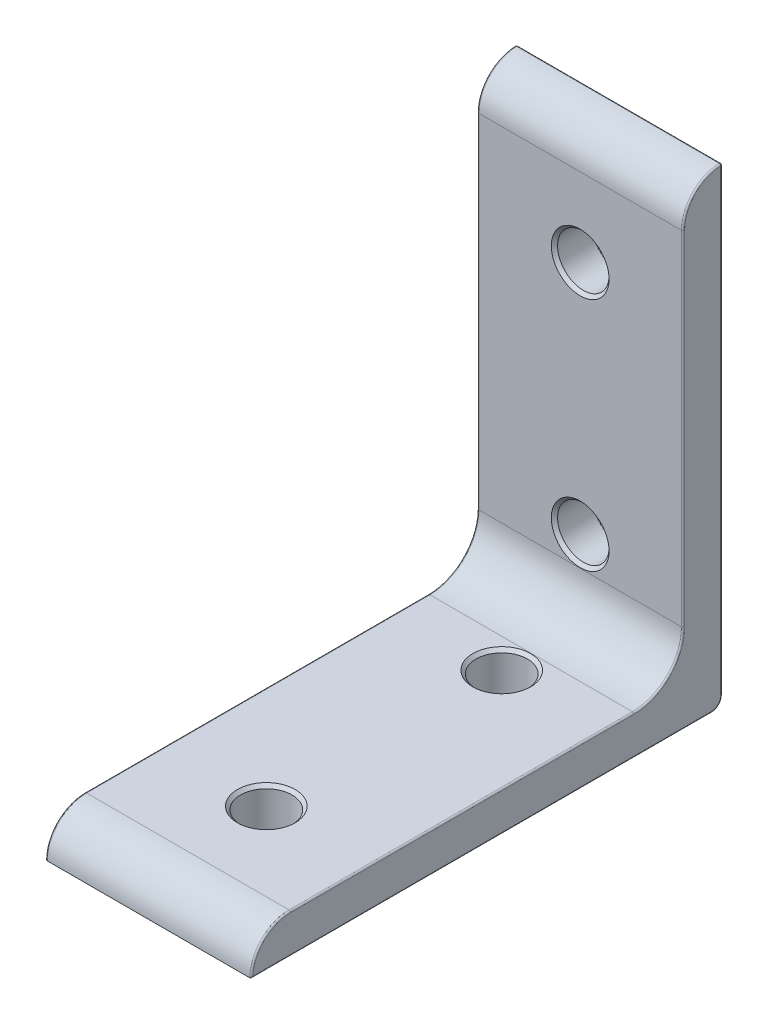
ISO-10303-21;
HEADER;
FILE_DESCRIPTION(('STEP AP214'),'2;1');
FILE_NAME('part.step','',(''),(''),'','','');
FILE_SCHEMA(('AUTOMOTIVE_DESIGN { 1 0 10303 214 1 1 1 1 }'));
ENDSEC;
DATA;
#1=APPLICATION_CONTEXT('core data for automotive mechanical design processes');
#2=APPLICATION_PROTOCOL_DEFINITION('international standard','automotive_design',2000,#1);
#3=PRODUCT_CONTEXT('',#1,'mechanical');
#4=PRODUCT('Part','Part','',(#3));
#5=PRODUCT_RELATED_PRODUCT_CATEGORY('part','',(#4));
#6=PRODUCT_DEFINITION_FORMATION('','',#4);
#7=PRODUCT_DEFINITION_CONTEXT('part definition',#1,'design');
#8=PRODUCT_DEFINITION('design','',#6,#7);
#9=PRODUCT_DEFINITION_SHAPE('','',#8);
#10=(LENGTH_UNIT() NAMED_UNIT(*) SI_UNIT(.MILLI.,.METRE.));
#11=(NAMED_UNIT(*) PLANE_ANGLE_UNIT() SI_UNIT($,.RADIAN.));
#12=(NAMED_UNIT(*) SI_UNIT($,.STERADIAN.) SOLID_ANGLE_UNIT());
#13=UNCERTAINTY_MEASURE_WITH_UNIT(LENGTH_MEASURE(1.E-05),#10,'distance_accuracy_value','');
#14=(GEOMETRIC_REPRESENTATION_CONTEXT(3) GLOBAL_UNCERTAINTY_ASSIGNED_CONTEXT((#13)) GLOBAL_UNIT_ASSIGNED_CONTEXT((#10,
#11,#12)) REPRESENTATION_CONTEXT('',''));
#15=CARTESIAN_POINT('',(0.,0.,0.));
#16=DIRECTION('',(0.,0.,1.));
#17=DIRECTION('',(1.,0.,0.));
#18=AXIS2_PLACEMENT_3D('',#15,#16,#17);
#19=CARTESIAN_POINT('',(-16.637,-38.1,63.5));
#20=DIRECTION('',(1.,0.,0.));
#21=DIRECTION('',(0.,0.,-1.));
#22=AXIS2_PLACEMENT_3D('',#19,#20,#21);
#23=CYLINDRICAL_SURFACE('',#22,6.35);
#24=DIRECTION('',(1.,0.,0.));
#25=VECTOR('',#24,1.);
#26=CARTESIAN_POINT('',(-16.637,-31.75,63.5));
#27=LINE('',#26,#25);
#28=CARTESIAN_POINT('',(-16.383,-31.75,63.5));
#29=VERTEX_POINT('',#28);
#30=CARTESIAN_POINT('',(16.383,-31.75,63.5));
#31=VERTEX_POINT('',#30);
#32=EDGE_CURVE('E213',#29,#31,#27,.T.);
#33=ORIENTED_EDGE('',*,*,#32,.F.);
#34=CARTESIAN_POINT('',(-16.383,-38.1,63.5));
#35=DIRECTION('',(1.,0.,0.));
#36=DIRECTION('',(0.,0.,-1.));
#37=AXIS2_PLACEMENT_3D('',#34,#35,#36);
#38=CIRCLE('',#37,6.35);
#39=CARTESIAN_POINT('',(-16.383,-38.1,69.85));
#40=VERTEX_POINT('',#39);
#41=EDGE_CURVE('E327',#29,#40,#38,.T.);
#42=ORIENTED_EDGE('',*,*,#41,.T.);
#43=DIRECTION('',(1.,0.,0.));
#44=VECTOR('',#43,1.);
#45=CARTESIAN_POINT('',(-16.637,-38.1,69.85));
#46=LINE('',#45,#44);
#47=CARTESIAN_POINT('',(16.383,-38.1,69.85));
#48=VERTEX_POINT('',#47);
#49=EDGE_CURVE('E203',#40,#48,#46,.T.);
#50=ORIENTED_EDGE('',*,*,#49,.T.);
#51=CARTESIAN_POINT('',(16.383,-38.1,63.5));
#52=DIRECTION('',(1.,0.,0.));
#53=DIRECTION('',(0.,0.,-1.));
#54=AXIS2_PLACEMENT_3D('',#51,#52,#53);
#55=CIRCLE('',#54,6.35);
#56=EDGE_CURVE('E324',#48,#31,#55,.F.);
#57=ORIENTED_EDGE('',*,*,#56,.T.);
#58=EDGE_LOOP('',(#33,#42,#50,#57));
#59=FACE_BOUND('',#58,.T.);
#60=ADVANCED_FACE('F51',(#59),#23,.T.);
#61=CARTESIAN_POINT('',(-16.637,-31.75,7.93749999999999));
#62=DIRECTION('',(0.,1.,0.));
#63=DIRECTION('',(0.,0.,1.));
#64=AXIS2_PLACEMENT_3D('',#61,#62,#63);
#65=PLANE('',#64);
#66=CARTESIAN_POINT('',(0.,-31.75,50.8));
#67=DIRECTION('',(0.,1.,0.));
#68=DIRECTION('',(0.,0.,1.));
#69=AXIS2_PLACEMENT_3D('',#66,#67,#68);
#70=CIRCLE('',#69,4.67360000000003);
#71=CARTESIAN_POINT('',(0.,-31.75,55.4736));
#72=VERTEX_POINT('',#71);
#73=EDGE_CURVE('E257',#72,#72,#70,.F.);
#74=ORIENTED_EDGE('',*,*,#73,.T.);
#75=EDGE_LOOP('',(#74));
#76=FACE_BOUND('',#75,.T.);
#77=CARTESIAN_POINT('',(0.,-31.75,12.7));
#78=DIRECTION('',(0.,1.,0.));
#79=DIRECTION('',(0.,0.,1.));
#80=AXIS2_PLACEMENT_3D('',#77,#78,#79);
#81=CIRCLE('',#80,4.67360000000002);
#82=CARTESIAN_POINT('',(0.,-31.75,17.3736));
#83=VERTEX_POINT('',#82);
#84=EDGE_CURVE('E253',#83,#83,#81,.F.);
#85=ORIENTED_EDGE('',*,*,#84,.T.);
#86=EDGE_LOOP('',(#85));
#87=FACE_BOUND('',#86,.T.);
#88=DIRECTION('',(1.,0.,0.));
#89=VECTOR('',#88,1.);
#90=CARTESIAN_POINT('',(-16.637,-31.75,7.93749999999999));
#91=LINE('',#90,#89);
#92=CARTESIAN_POINT('',(-16.383,-31.75,7.93749999999999));
#93=VERTEX_POINT('',#92);
#94=CARTESIAN_POINT('',(16.383,-31.75,7.93749999999999));
#95=VERTEX_POINT('',#94);
#96=EDGE_CURVE('E221',#93,#95,#91,.T.);
#97=ORIENTED_EDGE('',*,*,#96,.F.);
#98=DIRECTION('',(0.,0.,1.));
#99=VECTOR('',#98,1.);
#100=CARTESIAN_POINT('',(-16.383,-31.75,63.5));
#101=LINE('',#100,#99);
#102=EDGE_CURVE('E333',#93,#29,#101,.T.);
#103=ORIENTED_EDGE('',*,*,#102,.T.);
#104=ORIENTED_EDGE('',*,*,#32,.T.);
#105=DIRECTION('',(0.,0.,1.));
#106=VECTOR('',#105,1.);
#107=CARTESIAN_POINT('',(16.383,-31.75,7.93749999999999));
#108=LINE('',#107,#106);
#109=EDGE_CURVE('E330',#31,#95,#108,.F.);
#110=ORIENTED_EDGE('',*,*,#109,.T.);
#111=EDGE_LOOP('',(#97,#103,#104,#110));
#112=FACE_BOUND('',#111,.T.);
#113=ADVANCED_FACE('F720',(#76,#87,#112),#65,.T.);
#114=CARTESIAN_POINT('',(-16.637,-23.8125,7.9375));
#115=DIRECTION('',(1.,0.,0.));
#116=DIRECTION('',(0.,0.,-1.));
#117=AXIS2_PLACEMENT_3D('',#114,#115,#116);
#118=CYLINDRICAL_SURFACE('',#117,7.93750000000001);
#119=DIRECTION('',(1.,0.,0.));
#120=VECTOR('',#119,1.);
#121=CARTESIAN_POINT('',(-16.637,-23.8125,0.));
#122=LINE('',#121,#120);
#123=CARTESIAN_POINT('',(-16.383,-23.8125,0.));
#124=VERTEX_POINT('',#123);
#125=CARTESIAN_POINT('',(16.383,-23.8125,0.));
#126=VERTEX_POINT('',#125);
#127=EDGE_CURVE('E572',#124,#126,#122,.T.);
#128=ORIENTED_EDGE('',*,*,#127,.F.);
#129=CARTESIAN_POINT('',(-16.383,-23.8125,7.9375));
#130=DIRECTION('',(1.,0.,0.));
#131=DIRECTION('',(0.,0.,-1.));
#132=AXIS2_PLACEMENT_3D('',#129,#130,#131);
#133=CIRCLE('',#132,7.93750000000001);
#134=EDGE_CURVE('E339',#124,#93,#133,.F.);
#135=ORIENTED_EDGE('',*,*,#134,.T.);
#136=ORIENTED_EDGE('',*,*,#96,.T.);
#137=CARTESIAN_POINT('',(16.383,-23.8125,7.9375));
#138=DIRECTION('',(1.,0.,0.));
#139=DIRECTION('',(0.,0.,-1.));
#140=AXIS2_PLACEMENT_3D('',#137,#138,#139);
#141=CIRCLE('',#140,7.93750000000001);
#142=EDGE_CURVE('E336',#95,#126,#141,.T.);
#143=ORIENTED_EDGE('',*,*,#142,.T.);
#144=EDGE_LOOP('',(#128,#135,#136,#143));
#145=FACE_BOUND('',#144,.T.);
#146=ADVANCED_FACE('F683',(#145),#118,.F.);
#147=CARTESIAN_POINT('',(-16.637,31.75,0.));
#148=DIRECTION('',(0.,0.,1.));
#149=DIRECTION('',(0.,-1.,0.));
#150=AXIS2_PLACEMENT_3D('',#147,#148,#149);
#151=PLANE('',#150);
#152=CARTESIAN_POINT('',(0.,19.05,0.));
#153=DIRECTION('',(0.,0.,1.));
#154=DIRECTION('',(0.,-1.,0.));
#155=AXIS2_PLACEMENT_3D('',#152,#153,#154);
#156=CIRCLE('',#155,4.6736);
#157=CARTESIAN_POINT('',(0.,14.3764,0.));
#158=VERTEX_POINT('',#157);
#159=EDGE_CURVE('E241',#158,#158,#156,.F.);
#160=ORIENTED_EDGE('',*,*,#159,.T.);
#161=EDGE_LOOP('',(#160));
#162=FACE_BOUND('',#161,.T.);
#163=CARTESIAN_POINT('',(0.,-19.05,0.));
#164=DIRECTION('',(0.,0.,1.));
#165=DIRECTION('',(0.,-1.,0.));
#166=AXIS2_PLACEMENT_3D('',#163,#164,#165);
#167=CIRCLE('',#166,4.6736);
#168=CARTESIAN_POINT('',(0.,-23.7236,0.));
#169=VERTEX_POINT('',#168);
#170=EDGE_CURVE('E237',#169,#169,#167,.F.);
#171=ORIENTED_EDGE('',*,*,#170,.T.);
#172=EDGE_LOOP('',(#171));
#173=FACE_BOUND('',#172,.T.);
#174=DIRECTION('',(1.,0.,0.));
#175=VECTOR('',#174,1.);
#176=CARTESIAN_POINT('',(-16.637,31.75,0.));
#177=LINE('',#176,#175);
#178=CARTESIAN_POINT('',(-16.383,31.75,0.));
#179=VERTEX_POINT('',#178);
#180=CARTESIAN_POINT('',(16.383,31.75,0.));
#181=VERTEX_POINT('',#180);
#182=EDGE_CURVE('E567',#179,#181,#177,.T.);
#183=ORIENTED_EDGE('',*,*,#182,.F.);
#184=DIRECTION('',(0.,-1.,0.));
#185=VECTOR('',#184,1.);
#186=CARTESIAN_POINT('',(-16.383,-23.8125,0.));
#187=LINE('',#186,#185);
#188=EDGE_CURVE('E11',#179,#124,#187,.T.);
#189=ORIENTED_EDGE('',*,*,#188,.T.);
#190=ORIENTED_EDGE('',*,*,#127,.T.);
#191=DIRECTION('',(0.,-1.,0.));
#192=VECTOR('',#191,1.);
#193=CARTESIAN_POINT('',(16.383,31.75,0.));
#194=LINE('',#193,#192);
#195=EDGE_CURVE('E61',#126,#181,#194,.F.);
#196=ORIENTED_EDGE('',*,*,#195,.T.);
#197=EDGE_LOOP('',(#183,#189,#190,#196));
#198=FACE_BOUND('',#197,.T.);
#199=ADVANCED_FACE('F699',(#162,#173,#198),#151,.T.);
#200=CARTESIAN_POINT('',(-16.637,31.75,-6.35));
#201=DIRECTION('',(1.,0.,0.));
#202=DIRECTION('',(0.,0.,-1.));
#203=AXIS2_PLACEMENT_3D('',#200,#201,#202);
#204=CYLINDRICAL_SURFACE('',#203,6.35);
#205=DIRECTION('',(1.,0.,0.));
#206=VECTOR('',#205,1.);
#207=CARTESIAN_POINT('',(-16.637,38.0944854527158,-6.08541666666667));
#208=LINE('',#207,#206);
#209=CARTESIAN_POINT('',(16.383,38.0944854527158,-6.08541666666667));
#210=VERTEX_POINT('',#209);
#211=CARTESIAN_POINT('',(-16.383,38.0944854527158,-6.08541666666667));
#212=VERTEX_POINT('',#211);
#213=EDGE_CURVE('E315',#210,#212,#208,.F.);
#214=ORIENTED_EDGE('',*,*,#213,.T.);
#215=CARTESIAN_POINT('',(-16.383,31.75,-6.35));
#216=DIRECTION('',(1.,0.,0.));
#217=DIRECTION('',(0.,0.,-1.));
#218=AXIS2_PLACEMENT_3D('',#215,#216,#217);
#219=CIRCLE('',#218,6.35);
#220=EDGE_CURVE('E321',#212,#179,#219,.T.);
#221=ORIENTED_EDGE('',*,*,#220,.T.);
#222=ORIENTED_EDGE('',*,*,#182,.T.);
#223=CARTESIAN_POINT('',(16.383,31.75,-6.35));
#224=DIRECTION('',(1.,0.,0.));
#225=DIRECTION('',(0.,0.,-1.));
#226=AXIS2_PLACEMENT_3D('',#223,#224,#225);
#227=CIRCLE('',#226,6.35);
#228=EDGE_CURVE('E318',#181,#210,#227,.F.);
#229=ORIENTED_EDGE('',*,*,#228,.T.);
#230=EDGE_LOOP('',(#214,#221,#222,#229));
#231=FACE_BOUND('',#230,.T.);
#232=ADVANCED_FACE('F702',(#231),#204,.T.);
#233=CARTESIAN_POINT('',(-16.637,-38.1,-6.35));
#234=DIRECTION('',(0.,0.,-1.));
#235=DIRECTION('',(-1.,0.,0.));
#236=AXIS2_PLACEMENT_3D('',#233,#234,#235);
#237=PLANE('',#236);
#238=CARTESIAN_POINT('',(0.,-19.05,-6.35));
#239=DIRECTION('',(0.,0.,-1.));
#240=DIRECTION('',(-1.,0.,0.));
#241=AXIS2_PLACEMENT_3D('',#238,#239,#240);
#242=CIRCLE('',#241,4.4196);
#243=CARTESIAN_POINT('',(-4.4196,-19.05,-6.35));
#244=VERTEX_POINT('',#243);
#245=EDGE_CURVE('E346',#244,#244,#242,.F.);
#246=ORIENTED_EDGE('',*,*,#245,.T.);
#247=EDGE_LOOP('',(#246));
#248=FACE_BOUND('',#247,.T.);
#249=CARTESIAN_POINT('',(0.,19.05,-6.35));
#250=DIRECTION('',(0.,0.,-1.));
#251=DIRECTION('',(-1.,0.,0.));
#252=AXIS2_PLACEMENT_3D('',#249,#250,#251);
#253=CIRCLE('',#252,4.4196);
#254=CARTESIAN_POINT('',(-4.4196,19.05,-6.35));
#255=VERTEX_POINT('',#254);
#256=EDGE_CURVE('E342',#255,#255,#253,.F.);
#257=ORIENTED_EDGE('',*,*,#256,.T.);
#258=EDGE_LOOP('',(#257));
#259=FACE_BOUND('',#258,.T.);
#260=DIRECTION('',(1.,0.,0.));
#261=VECTOR('',#260,1.);
#262=CARTESIAN_POINT('',(-16.637,-36.40455,-6.35));
#263=LINE('',#262,#261);
#264=CARTESIAN_POINT('',(16.383,-36.40455,-6.35));
#265=VERTEX_POINT('',#264);
#266=CARTESIAN_POINT('',(-16.383,-36.40455,-6.35));
#267=VERTEX_POINT('',#266);
#268=EDGE_CURVE('E212',#265,#267,#263,.F.);
#269=ORIENTED_EDGE('',*,*,#268,.T.);
#270=DIRECTION('',(0.,1.,0.));
#271=VECTOR('',#270,1.);
#272=CARTESIAN_POINT('',(-16.383,38.1,-6.35));
#273=LINE('',#272,#271);
#274=CARTESIAN_POINT('',(-16.383,37.8407060346072,-6.35));
#275=VERTEX_POINT('',#274);
#276=EDGE_CURVE('E69',#267,#275,#273,.T.);
#277=ORIENTED_EDGE('',*,*,#276,.T.);
#278=DIRECTION('',(1.,0.,0.));
#279=VECTOR('',#278,1.);
#280=CARTESIAN_POINT('',(-16.637,37.8407060346071,-6.35));
#281=LINE('',#280,#279);
#282=CARTESIAN_POINT('',(16.383,37.8407060346072,-6.35));
#283=VERTEX_POINT('',#282);
#284=EDGE_CURVE('E73',#275,#283,#281,.T.);
#285=ORIENTED_EDGE('',*,*,#284,.T.);
#286=DIRECTION('',(0.,1.,0.));
#287=VECTOR('',#286,1.);
#288=CARTESIAN_POINT('',(16.383,-38.1,-6.35));
#289=LINE('',#288,#287);
#290=EDGE_CURVE('E350',#283,#265,#289,.F.);
#291=ORIENTED_EDGE('',*,*,#290,.T.);
#292=EDGE_LOOP('',(#269,#277,#285,#291));
#293=FACE_BOUND('',#292,.T.);
#294=ADVANCED_FACE('F736',(#248,#259,#293),#237,.T.);
#295=CARTESIAN_POINT('',(-16.637,-38.1,69.85));
#296=DIRECTION('',(0.,-1.,0.));
#297=DIRECTION('',(0.,0.,-1.));
#298=AXIS2_PLACEMENT_3D('',#295,#296,#297);
#299=PLANE('',#298);
#300=CARTESIAN_POINT('',(0.,-38.1,12.7));
#301=DIRECTION('',(0.,-1.,0.));
#302=DIRECTION('',(0.,0.,-1.));
#303=AXIS2_PLACEMENT_3D('',#300,#301,#302);
#304=CIRCLE('',#303,4.1656);
#305=CARTESIAN_POINT('',(0.,-38.1,8.5344));
#306=VERTEX_POINT('',#305);
#307=EDGE_CURVE('E230',#306,#306,#304,.T.);
#308=ORIENTED_EDGE('',*,*,#307,.F.);
#309=EDGE_LOOP('',(#308));
#310=FACE_BOUND('',#309,.T.);
#311=CARTESIAN_POINT('',(0.,-38.1,50.8));
#312=DIRECTION('',(0.,-1.,0.));
#313=DIRECTION('',(0.,0.,-1.));
#314=AXIS2_PLACEMENT_3D('',#311,#312,#313);
#315=CIRCLE('',#314,4.1656);
#316=CARTESIAN_POINT('',(0.,-38.1,46.6344));
#317=VERTEX_POINT('',#316);
#318=EDGE_CURVE('E226',#317,#317,#315,.T.);
#319=ORIENTED_EDGE('',*,*,#318,.F.);
#320=EDGE_LOOP('',(#319));
#321=FACE_BOUND('',#320,.T.);
#322=ORIENTED_EDGE('',*,*,#49,.F.);
#323=DIRECTION('',(0.,0.,-1.));
#324=VECTOR('',#323,1.);
#325=CARTESIAN_POINT('',(-16.383,-38.1,-4.65454999999997));
#326=LINE('',#325,#324);
#327=CARTESIAN_POINT('',(-16.383,-38.1,-4.65454999999999));
#328=VERTEX_POINT('',#327);
#329=EDGE_CURVE('E176',#40,#328,#326,.T.);
#330=ORIENTED_EDGE('',*,*,#329,.T.);
#331=DIRECTION('',(1.,0.,0.));
#332=VECTOR('',#331,1.);
#333=CARTESIAN_POINT('',(-16.637,-38.1,-4.65454999999999));
#334=LINE('',#333,#332);
#335=CARTESIAN_POINT('',(16.383,-38.1,-4.65454999999999));
#336=VERTEX_POINT('',#335);
#337=EDGE_CURVE('E200',#328,#336,#334,.T.);
#338=ORIENTED_EDGE('',*,*,#337,.T.);
#339=DIRECTION('',(0.,0.,-1.));
#340=VECTOR('',#339,1.);
#341=CARTESIAN_POINT('',(16.383,-38.1,69.85));
#342=LINE('',#341,#340);
#343=EDGE_CURVE('E207',#336,#48,#342,.F.);
#344=ORIENTED_EDGE('',*,*,#343,.T.);
#345=EDGE_LOOP('',(#322,#330,#338,#344));
#346=FACE_BOUND('',#345,.T.);
#347=ADVANCED_FACE('F199',(#310,#321,#346),#299,.T.);
#348=CARTESIAN_POINT('',(-16.637,-38.1,63.5));
#349=DIRECTION('',(1.,0.,0.));
#350=DIRECTION('',(0.,0.,-1.));
#351=AXIS2_PLACEMENT_3D('',#348,#349,#350);
#352=PLANE('',#351);
#353=DIRECTION('',(0.,1.,0.));
#354=VECTOR('',#353,1.);
#355=CARTESIAN_POINT('',(-16.637,-36.40455,-6.096));
#356=LINE('',#355,#354);
#357=CARTESIAN_POINT('',(-16.637,37.8407060346072,-6.096));
#358=VERTEX_POINT('',#357);
#359=CARTESIAN_POINT('',(-16.637,-36.40455,-6.096));
#360=VERTEX_POINT('',#359);
#361=EDGE_CURVE('E283',#358,#360,#356,.F.);
#362=ORIENTED_EDGE('',*,*,#361,.T.);
#363=CARTESIAN_POINT('',(-16.637,-36.40455,-4.65454999999999));
#364=DIRECTION('',(1.,0.,0.));
#365=DIRECTION('',(0.,0.,-1.));
#366=AXIS2_PLACEMENT_3D('',#363,#364,#365);
#367=CIRCLE('',#366,1.44145);
#368=CARTESIAN_POINT('',(-16.637,-37.846,-4.65454999999999));
#369=VERTEX_POINT('',#368);
#370=EDGE_CURVE('E286',#360,#369,#367,.F.);
#371=ORIENTED_EDGE('',*,*,#370,.T.);
#372=DIRECTION('',(0.,0.,-1.));
#373=VECTOR('',#372,1.);
#374=CARTESIAN_POINT('',(-16.637,-37.846,69.85));
#375=LINE('',#374,#373);
#376=CARTESIAN_POINT('',(-16.637,-37.846,69.5907060346072));
#377=VERTEX_POINT('',#376);
#378=EDGE_CURVE('E178',#369,#377,#375,.F.);
#379=ORIENTED_EDGE('',*,*,#378,.T.);
#380=CARTESIAN_POINT('',(-16.637,-38.1,63.5));
#381=DIRECTION('',(1.,0.,0.));
#382=DIRECTION('',(0.,0.,-1.));
#383=AXIS2_PLACEMENT_3D('',#380,#381,#382);
#384=CIRCLE('',#383,6.096);
#385=CARTESIAN_POINT('',(-16.637,-32.004,63.5));
#386=VERTEX_POINT('',#385);
#387=EDGE_CURVE('E275',#377,#386,#384,.F.);
#388=ORIENTED_EDGE('',*,*,#387,.T.);
#389=DIRECTION('',(0.,0.,1.));
#390=VECTOR('',#389,1.);
#391=CARTESIAN_POINT('',(-16.637,-32.004,7.93749999999999));
#392=LINE('',#391,#390);
#393=CARTESIAN_POINT('',(-16.637,-32.004,7.93749999999999));
#394=VERTEX_POINT('',#393);
#395=EDGE_CURVE('E272',#386,#394,#392,.F.);
#396=ORIENTED_EDGE('',*,*,#395,.T.);
#397=CARTESIAN_POINT('',(-16.637,-23.8125,7.9375));
#398=DIRECTION('',(1.,0.,0.));
#399=DIRECTION('',(0.,0.,-1.));
#400=AXIS2_PLACEMENT_3D('',#397,#398,#399);
#401=CIRCLE('',#400,8.19150000000001);
#402=CARTESIAN_POINT('',(-16.637,-23.8125,-0.254000000000007));
#403=VERTEX_POINT('',#402);
#404=EDGE_CURVE('E269',#394,#403,#401,.T.);
#405=ORIENTED_EDGE('',*,*,#404,.T.);
#406=DIRECTION('',(0.,-1.,0.));
#407=VECTOR('',#406,1.);
#408=CARTESIAN_POINT('',(-16.637,31.75,-0.253999999999998));
#409=LINE('',#408,#407);
#410=CARTESIAN_POINT('',(-16.637,31.75,-0.253999999999998));
#411=VERTEX_POINT('',#410);
#412=EDGE_CURVE('E206',#403,#411,#409,.F.);
#413=ORIENTED_EDGE('',*,*,#412,.T.);
#414=CARTESIAN_POINT('',(-16.637,31.75,-6.35));
#415=DIRECTION('',(1.,0.,0.));
#416=DIRECTION('',(0.,0.,-1.));
#417=AXIS2_PLACEMENT_3D('',#414,#415,#416);
#418=CIRCLE('',#417,6.096);
#419=EDGE_CURVE('E278',#411,#358,#418,.F.);
#420=ORIENTED_EDGE('',*,*,#419,.T.);
#421=EDGE_LOOP('',(#362,#371,#379,#388,#396,#405,#413,#420));
#422=FACE_BOUND('',#421,.T.);
#423=ADVANCED_FACE('F713',(#422),#352,.F.);
#424=CARTESIAN_POINT('',(16.637,-38.1,63.5));
#425=DIRECTION('',(1.,0.,0.));
#426=DIRECTION('',(0.,0.,-1.));
#427=AXIS2_PLACEMENT_3D('',#424,#425,#426);
#428=PLANE('',#427);
#429=DIRECTION('',(0.,0.,-1.));
#430=VECTOR('',#429,1.);
#431=CARTESIAN_POINT('',(16.637,-37.846,63.5));
#432=LINE('',#431,#430);
#433=CARTESIAN_POINT('',(16.637,-37.846,69.5907060346072));
#434=VERTEX_POINT('',#433);
#435=CARTESIAN_POINT('',(16.637,-37.846,-4.65454999999999));
#436=VERTEX_POINT('',#435);
#437=EDGE_CURVE('E305',#434,#436,#432,.T.);
#438=ORIENTED_EDGE('',*,*,#437,.T.);
#439=CARTESIAN_POINT('',(16.637,-36.40455,-4.65454999999999));
#440=DIRECTION('',(1.,0.,0.));
#441=DIRECTION('',(0.,0.,-1.));
#442=AXIS2_PLACEMENT_3D('',#439,#440,#441);
#443=CIRCLE('',#442,1.44145);
#444=CARTESIAN_POINT('',(16.637,-36.40455,-6.096));
#445=VERTEX_POINT('',#444);
#446=EDGE_CURVE('E312',#436,#445,#443,.T.);
#447=ORIENTED_EDGE('',*,*,#446,.T.);
#448=DIRECTION('',(0.,1.,0.));
#449=VECTOR('',#448,1.);
#450=CARTESIAN_POINT('',(16.637,-38.1,-6.096));
#451=LINE('',#450,#449);
#452=CARTESIAN_POINT('',(16.637,37.8407060346072,-6.096));
#453=VERTEX_POINT('',#452);
#454=EDGE_CURVE('E309',#445,#453,#451,.T.);
#455=ORIENTED_EDGE('',*,*,#454,.T.);
#456=CARTESIAN_POINT('',(16.637,31.75,-6.35));
#457=DIRECTION('',(1.,0.,0.));
#458=DIRECTION('',(0.,0.,-1.));
#459=AXIS2_PLACEMENT_3D('',#456,#457,#458);
#460=CIRCLE('',#459,6.096);
#461=CARTESIAN_POINT('',(16.637,31.75,-0.254000000000007));
#462=VERTEX_POINT('',#461);
#463=EDGE_CURVE('E302',#453,#462,#460,.T.);
#464=ORIENTED_EDGE('',*,*,#463,.T.);
#465=DIRECTION('',(0.,-1.,0.));
#466=VECTOR('',#465,1.);
#467=CARTESIAN_POINT('',(16.637,-38.1,-0.254000000000018));
#468=LINE('',#467,#466);
#469=CARTESIAN_POINT('',(16.637,-23.8125,-0.254000000000016));
#470=VERTEX_POINT('',#469);
#471=EDGE_CURVE('E193',#462,#470,#468,.T.);
#472=ORIENTED_EDGE('',*,*,#471,.T.);
#473=CARTESIAN_POINT('',(16.637,-23.8125,7.9375));
#474=DIRECTION('',(1.,0.,0.));
#475=DIRECTION('',(0.,0.,-1.));
#476=AXIS2_PLACEMENT_3D('',#473,#474,#475);
#477=CIRCLE('',#476,8.19150000000001);
#478=CARTESIAN_POINT('',(16.637,-32.004,7.93749999999999));
#479=VERTEX_POINT('',#478);
#480=EDGE_CURVE('E293',#470,#479,#477,.F.);
#481=ORIENTED_EDGE('',*,*,#480,.T.);
#482=DIRECTION('',(0.,0.,1.));
#483=VECTOR('',#482,1.);
#484=CARTESIAN_POINT('',(16.637,-32.004,63.5));
#485=LINE('',#484,#483);
#486=CARTESIAN_POINT('',(16.637,-32.004,63.5));
#487=VERTEX_POINT('',#486);
#488=EDGE_CURVE('E296',#479,#487,#485,.T.);
#489=ORIENTED_EDGE('',*,*,#488,.T.);
#490=CARTESIAN_POINT('',(16.637,-38.1,63.5));
#491=DIRECTION('',(1.,0.,0.));
#492=DIRECTION('',(0.,0.,-1.));
#493=AXIS2_PLACEMENT_3D('',#490,#491,#492);
#494=CIRCLE('',#493,6.096);
#495=EDGE_CURVE('E299',#487,#434,#494,.T.);
#496=ORIENTED_EDGE('',*,*,#495,.T.);
#497=EDGE_LOOP('',(#438,#447,#455,#464,#472,#481,#489,#496));
#498=FACE_BOUND('',#497,.T.);
#499=ADVANCED_FACE('F730',(#498),#428,.T.);
#500=CARTESIAN_POINT('',(-16.637,-36.40455,-4.65454999999999));
#501=DIRECTION('',(1.,0.,0.));
#502=DIRECTION('',(0.,0.,-1.));
#503=AXIS2_PLACEMENT_3D('',#500,#501,#502);
#504=CYLINDRICAL_SURFACE('',#503,1.69545);
#505=ORIENTED_EDGE('',*,*,#337,.F.);
#506=CARTESIAN_POINT('',(-16.383,-36.40455,-4.65454999999999));
#507=DIRECTION('',(1.,0.,0.));
#508=DIRECTION('',(0.,0.,-1.));
#509=AXIS2_PLACEMENT_3D('',#506,#507,#508);
#510=CIRCLE('',#509,1.69545);
#511=EDGE_CURVE('E185',#328,#267,#510,.T.);
#512=ORIENTED_EDGE('',*,*,#511,.T.);
#513=ORIENTED_EDGE('',*,*,#268,.F.);
#514=CARTESIAN_POINT('',(16.383,-36.40455,-4.65454999999999));
#515=DIRECTION('',(1.,0.,0.));
#516=DIRECTION('',(0.,0.,-1.));
#517=AXIS2_PLACEMENT_3D('',#514,#515,#516);
#518=CIRCLE('',#517,1.69545);
#519=EDGE_CURVE('E194',#265,#336,#518,.F.);
#520=ORIENTED_EDGE('',*,*,#519,.T.);
#521=EDGE_LOOP('',(#505,#512,#513,#520));
#522=FACE_BOUND('',#521,.T.);
#523=ADVANCED_FACE('F209',(#522),#504,.T.);
#524=CARTESIAN_POINT('',(0.,-19.05,-6.35));
#525=DIRECTION('',(0.,0.,1.));
#526=DIRECTION('',(1.,0.,0.));
#527=AXIS2_PLACEMENT_3D('',#524,#525,#526);
#528=CYLINDRICAL_SURFACE('',#527,4.1656);
#529=CARTESIAN_POINT('',(0.,-19.05,-6.096));
#530=DIRECTION('',(0.,0.,-1.));
#531=DIRECTION('',(-1.,0.,0.));
#532=AXIS2_PLACEMENT_3D('',#529,#530,#531);
#533=CIRCLE('',#532,4.1656);
#534=CARTESIAN_POINT('',(-4.1656,-19.05,-6.096));
#535=VERTEX_POINT('',#534);
#536=EDGE_CURVE('E357',#535,#535,#533,.T.);
#537=ORIENTED_EDGE('',*,*,#536,.T.);
#538=EDGE_LOOP('',(#537));
#539=FACE_BOUND('',#538,.T.);
#540=CARTESIAN_POINT('',(0.,-19.05,-0.507999999999995));
#541=DIRECTION('',(0.,0.,1.));
#542=DIRECTION('',(1.,0.,0.));
#543=AXIS2_PLACEMENT_3D('',#540,#541,#542);
#544=CIRCLE('',#543,4.1656);
#545=CARTESIAN_POINT('',(4.1656,-19.05,-0.507999999999995));
#546=VERTEX_POINT('',#545);
#547=EDGE_CURVE('E245',#546,#546,#544,.T.);
#548=ORIENTED_EDGE('',*,*,#547,.T.);
#549=EDGE_LOOP('',(#548));
#550=FACE_BOUND('',#549,.T.);
#551=ADVANCED_FACE('F758',(#539,#550),#528,.F.);
#552=CARTESIAN_POINT('',(0.,19.05,-6.35));
#553=DIRECTION('',(0.,0.,1.));
#554=DIRECTION('',(1.,0.,0.));
#555=AXIS2_PLACEMENT_3D('',#552,#553,#554);
#556=CYLINDRICAL_SURFACE('',#555,4.1656);
#557=CARTESIAN_POINT('',(0.,19.05,-6.096));
#558=DIRECTION('',(0.,0.,-1.));
#559=DIRECTION('',(-1.,0.,0.));
#560=AXIS2_PLACEMENT_3D('',#557,#558,#559);
#561=CIRCLE('',#560,4.1656);
#562=CARTESIAN_POINT('',(-4.1656,19.05,-6.096));
#563=VERTEX_POINT('',#562);
#564=EDGE_CURVE('E361',#563,#563,#561,.T.);
#565=ORIENTED_EDGE('',*,*,#564,.T.);
#566=EDGE_LOOP('',(#565));
#567=FACE_BOUND('',#566,.T.);
#568=CARTESIAN_POINT('',(0.,19.05,-0.507999999999989));
#569=DIRECTION('',(0.,0.,1.));
#570=DIRECTION('',(1.,0.,0.));
#571=AXIS2_PLACEMENT_3D('',#568,#569,#570);
#572=CIRCLE('',#571,4.1656);
#573=CARTESIAN_POINT('',(4.1656,19.05,-0.507999999999989));
#574=VERTEX_POINT('',#573);
#575=EDGE_CURVE('E218',#574,#574,#572,.T.);
#576=ORIENTED_EDGE('',*,*,#575,.T.);
#577=EDGE_LOOP('',(#576));
#578=FACE_BOUND('',#577,.T.);
#579=ADVANCED_FACE('F788',(#567,#578),#556,.F.);
#580=CARTESIAN_POINT('',(0.,-39.624,50.8));
#581=DIRECTION('',(0.,1.,0.));
#582=DIRECTION('',(0.,0.,1.));
#583=AXIS2_PLACEMENT_3D('',#580,#581,#582);
#584=CYLINDRICAL_SURFACE('',#583,4.1656);
#585=CARTESIAN_POINT('',(0.,-32.258,50.8));
#586=DIRECTION('',(0.,1.,0.));
#587=DIRECTION('',(0.,0.,1.));
#588=AXIS2_PLACEMENT_3D('',#585,#586,#587);
#589=CIRCLE('',#588,4.1656);
#590=CARTESIAN_POINT('',(0.,-32.258,54.9656));
#591=VERTEX_POINT('',#590);
#592=EDGE_CURVE('E249',#591,#591,#589,.T.);
#593=ORIENTED_EDGE('',*,*,#592,.T.);
#594=EDGE_LOOP('',(#593));
#595=FACE_BOUND('',#594,.T.);
#596=ORIENTED_EDGE('',*,*,#318,.T.);
#597=EDGE_LOOP('',(#596));
#598=FACE_BOUND('',#597,.T.);
#599=ADVANCED_FACE('F781',(#595,#598),#584,.F.);
#600=CARTESIAN_POINT('',(0.,-39.624,12.7));
#601=DIRECTION('',(0.,1.,0.));
#602=DIRECTION('',(0.,0.,1.));
#603=AXIS2_PLACEMENT_3D('',#600,#601,#602);
#604=CYLINDRICAL_SURFACE('',#603,4.1656);
#605=CARTESIAN_POINT('',(0.,-32.258,12.7));
#606=DIRECTION('',(0.,1.,0.));
#607=DIRECTION('',(0.,0.,1.));
#608=AXIS2_PLACEMENT_3D('',#605,#606,#607);
#609=CIRCLE('',#608,4.1656);
#610=CARTESIAN_POINT('',(0.,-32.258,16.8656));
#611=VERTEX_POINT('',#610);
#612=EDGE_CURVE('E261',#611,#611,#609,.T.);
#613=ORIENTED_EDGE('',*,*,#612,.T.);
#614=EDGE_LOOP('',(#613));
#615=FACE_BOUND('',#614,.T.);
#616=ORIENTED_EDGE('',*,*,#307,.T.);
#617=EDGE_LOOP('',(#616));
#618=FACE_BOUND('',#617,.T.);
#619=ADVANCED_FACE('F763',(#615,#618),#604,.F.);
#620=CARTESIAN_POINT('',(0.,19.05,-0.507999999999989));
#621=DIRECTION('',(0.,0.,1.));
#622=DIRECTION('',(1.,0.,0.));
#623=AXIS2_PLACEMENT_3D('',#620,#621,#622);
#624=CONICAL_SURFACE('',#623,4.1656,0.785398163397458);
#625=ORIENTED_EDGE('',*,*,#159,.F.);
#626=EDGE_LOOP('',(#625));
#627=FACE_BOUND('',#626,.T.);
#628=ORIENTED_EDGE('',*,*,#575,.F.);
#629=EDGE_LOOP('',(#628));
#630=FACE_BOUND('',#629,.T.);
#631=ADVANCED_FACE('F759',(#627,#630),#624,.F.);
#632=CARTESIAN_POINT('',(0.,-19.05,-0.507999999999995));
#633=DIRECTION('',(0.,0.,1.));
#634=DIRECTION('',(1.,0.,0.));
#635=AXIS2_PLACEMENT_3D('',#632,#633,#634);
#636=CONICAL_SURFACE('',#635,4.1656,0.785398163397458);
#637=ORIENTED_EDGE('',*,*,#170,.F.);
#638=EDGE_LOOP('',(#637));
#639=FACE_BOUND('',#638,.T.);
#640=ORIENTED_EDGE('',*,*,#547,.F.);
#641=EDGE_LOOP('',(#640));
#642=FACE_BOUND('',#641,.T.);
#643=ADVANCED_FACE('F762',(#639,#642),#636,.F.);
#644=CARTESIAN_POINT('',(0.,-32.258,50.8));
#645=DIRECTION('',(0.,1.,0.));
#646=DIRECTION('',(0.,0.,1.));
#647=AXIS2_PLACEMENT_3D('',#644,#645,#646);
#648=CONICAL_SURFACE('',#647,4.1656,0.785398163397451);
#649=ORIENTED_EDGE('',*,*,#73,.F.);
#650=EDGE_LOOP('',(#649));
#651=FACE_BOUND('',#650,.T.);
#652=ORIENTED_EDGE('',*,*,#592,.F.);
#653=EDGE_LOOP('',(#652));
#654=FACE_BOUND('',#653,.T.);
#655=ADVANCED_FACE('F767',(#651,#654),#648,.F.);
#656=CARTESIAN_POINT('',(0.,-32.258,12.7));
#657=DIRECTION('',(0.,1.,0.));
#658=DIRECTION('',(0.,0.,1.));
#659=AXIS2_PLACEMENT_3D('',#656,#657,#658);
#660=CONICAL_SURFACE('',#659,4.1656,0.785398163397453);
#661=ORIENTED_EDGE('',*,*,#84,.F.);
#662=EDGE_LOOP('',(#661));
#663=FACE_BOUND('',#662,.T.);
#664=ORIENTED_EDGE('',*,*,#612,.F.);
#665=EDGE_LOOP('',(#664));
#666=FACE_BOUND('',#665,.T.);
#667=ADVANCED_FACE('F443',(#663,#666),#660,.F.);
#668=CARTESIAN_POINT('',(16.383,-38.1,63.5));
#669=DIRECTION('',(1.,0.,0.));
#670=DIRECTION('',(0.,0.,-1.));
#671=AXIS2_PLACEMENT_3D('',#668,#669,#670);
#672=TOROIDAL_SURFACE('',#671,6.096,0.254);
#673=CARTESIAN_POINT('',(16.383,-38.1,69.85));
#674=CARTESIAN_POINT('',(16.3943829865136,-38.1000192372734,69.8500187665136));
#675=CARTESIAN_POINT('',(16.4057376393138,-38.0992361565714,69.8492361703857));
#676=CARTESIAN_POINT('',(16.4279632991582,-38.096232451298,69.8462316284245));
#677=CARTESIAN_POINT('',(16.4388376189161,-38.0940242130851,69.8440220844014));
#678=CARTESIAN_POINT('',(16.4598540462342,-38.0883398533788,69.8383297200288));
#679=CARTESIAN_POINT('',(16.4699980314885,-38.0848671332741,69.8348503154785));
#680=CARTESIAN_POINT('',(16.4894270880188,-38.0768676045891,69.8268266013445));
#681=CARTESIAN_POINT('',(16.4987101976794,-38.0723384674947,69.8222799392094));
#682=CARTESIAN_POINT('',(16.5198657374014,-38.0604404154231,69.8103202440151));
#683=CARTESIAN_POINT('',(16.5312725573051,-38.0526628823902,69.8024907184488));
#684=CARTESIAN_POINT('',(16.5521688863731,-38.0359413690363,69.7856206565405));
#685=CARTESIAN_POINT('',(16.5616547036368,-38.0269951960013,69.7765778428246));
#686=CARTESIAN_POINT('',(16.5821776270097,-38.0046102142591,69.7538966425141));
#687=CARTESIAN_POINT('',(16.592349900991,-37.9907915875412,69.7398528669866));
#688=CARTESIAN_POINT('',(16.6094431628897,-37.9622609103138,69.7107508715219));
#689=CARTESIAN_POINT('',(16.6163599621309,-37.9475477361492,69.6956913730112));
#690=CARTESIAN_POINT('',(16.6267993327385,-37.9187634884432,69.6661170031999));
#691=CARTESIAN_POINT('',(16.6305342581579,-37.9047248614008,69.6516436288982));
#692=CARTESIAN_POINT('',(16.6355660199023,-37.8765147777737,69.6224545798043));
#693=CARTESIAN_POINT('',(16.6368676377355,-37.8623436367998,69.6077394376454));
#694=CARTESIAN_POINT('',(16.6369967980102,-37.8474716366519,69.5922401777672));
#695=CARTESIAN_POINT('',(16.6369999943713,-37.8467357626201,69.5914731210551));
#696=CARTESIAN_POINT('',(16.637,-37.846,69.5907060346072));
#697=B_SPLINE_CURVE_WITH_KNOTS('',3,(#673,#674,#675,#676,#677,#678,#679,#680,#681,#682,#683,
#684,#685,#686,#687,#688,#689,#690,#691,#692,#693,#694,#695,#696),.UNSPECIFIED.,.F.,.F.,(4,2,2,
2,2,2,2,2,2,2,2,4),(0.,0.0340503146785645,0.0678086047436617,0.101476749675277,
0.135219817874375,0.182571307227297,0.230012953547173,0.296174610413962,0.362421163419737,
0.423791777570249,0.485041669701412,0.488230544593131),.UNSPECIFIED.);
#698=EDGE_CURVE('E447',#434,#48,#697,.F.);
#699=ORIENTED_EDGE('',*,*,#698,.F.);
#700=ORIENTED_EDGE('',*,*,#495,.F.);
#701=CARTESIAN_POINT('',(16.383,-32.004,63.5));
#702=DIRECTION('',(0.,0.,-1.));
#703=DIRECTION('',(-1.,0.,0.));
#704=AXIS2_PLACEMENT_3D('',#701,#702,#703);
#705=CIRCLE('',#704,0.254);
#706=EDGE_CURVE('E55',#31,#487,#705,.T.);
#707=ORIENTED_EDGE('',*,*,#706,.F.);
#708=ORIENTED_EDGE('',*,*,#56,.F.);
#709=EDGE_LOOP('',(#699,#700,#707,#708));
#710=FACE_BOUND('',#709,.T.);
#711=ADVANCED_FACE('F438',(#710),#672,.T.);
#712=CARTESIAN_POINT('',(16.383,-32.004,63.5));
#713=DIRECTION('',(0.,0.,1.));
#714=DIRECTION('',(1.,0.,0.));
#715=AXIS2_PLACEMENT_3D('',#712,#713,#714);
#716=CYLINDRICAL_SURFACE('',#715,0.254);
#717=ORIENTED_EDGE('',*,*,#706,.T.);
#718=ORIENTED_EDGE('',*,*,#488,.F.);
#719=CARTESIAN_POINT('',(16.383,-32.004,7.93749999999999));
#720=DIRECTION('',(0.,0.,-1.));
#721=DIRECTION('',(-1.,0.,0.));
#722=AXIS2_PLACEMENT_3D('',#719,#720,#721);
#723=CIRCLE('',#722,0.254);
#724=EDGE_CURVE('E455',#95,#479,#723,.T.);
#725=ORIENTED_EDGE('',*,*,#724,.F.);
#726=ORIENTED_EDGE('',*,*,#109,.F.);
#727=EDGE_LOOP('',(#717,#718,#725,#726));
#728=FACE_BOUND('',#727,.T.);
#729=ADVANCED_FACE('F442',(#728),#716,.T.);
#730=CARTESIAN_POINT('',(16.383,-37.846,63.5));
#731=DIRECTION('',(0.,0.,-1.));
#732=DIRECTION('',(-1.,0.,0.));
#733=AXIS2_PLACEMENT_3D('',#730,#731,#732);
#734=CYLINDRICAL_SURFACE('',#733,0.254);
#735=ORIENTED_EDGE('',*,*,#698,.T.);
#736=ORIENTED_EDGE('',*,*,#343,.F.);
#737=CARTESIAN_POINT('',(16.383,-37.846,-4.65454999999999));
#738=DIRECTION('',(0.,0.,-1.));
#739=DIRECTION('',(-1.,0.,0.));
#740=AXIS2_PLACEMENT_3D('',#737,#738,#739);
#741=CIRCLE('',#740,0.254);
#742=EDGE_CURVE('E459',#436,#336,#741,.T.);
#743=ORIENTED_EDGE('',*,*,#742,.F.);
#744=ORIENTED_EDGE('',*,*,#437,.F.);
#745=EDGE_LOOP('',(#735,#736,#743,#744));
#746=FACE_BOUND('',#745,.T.);
#747=ADVANCED_FACE('F436',(#746),#734,.T.);
#748=CARTESIAN_POINT('',(16.383,-23.8125,7.9375));
#749=DIRECTION('',(1.,0.,0.));
#750=DIRECTION('',(0.,0.,-1.));
#751=AXIS2_PLACEMENT_3D('',#748,#749,#750);
#752=TOROIDAL_SURFACE('',#751,8.19150000000001,0.254);
#753=ORIENTED_EDGE('',*,*,#724,.T.);
#754=ORIENTED_EDGE('',*,*,#480,.F.);
#755=CARTESIAN_POINT('',(16.383,-23.8125,-0.254000000000009));
#756=DIRECTION('',(0.,1.,0.));
#757=DIRECTION('',(0.,0.,1.));
#758=AXIS2_PLACEMENT_3D('',#755,#756,#757);
#759=CIRCLE('',#758,0.254);
#760=EDGE_CURVE('E463',#126,#470,#759,.T.);
#761=ORIENTED_EDGE('',*,*,#760,.F.);
#762=ORIENTED_EDGE('',*,*,#142,.F.);
#763=EDGE_LOOP('',(#753,#754,#761,#762));
#764=FACE_BOUND('',#763,.T.);
#765=ADVANCED_FACE('F432',(#764),#752,.T.);
#766=CARTESIAN_POINT('',(16.383,-36.40455,-4.65454999999999));
#767=DIRECTION('',(1.,0.,0.));
#768=DIRECTION('',(0.,0.,-1.));
#769=AXIS2_PLACEMENT_3D('',#766,#767,#768);
#770=TOROIDAL_SURFACE('',#769,1.44145,0.254);
#771=ORIENTED_EDGE('',*,*,#742,.T.);
#772=ORIENTED_EDGE('',*,*,#519,.F.);
#773=CARTESIAN_POINT('',(16.383,-36.40455,-6.09599999999999));
#774=DIRECTION('',(0.,1.,0.));
#775=DIRECTION('',(0.,0.,1.));
#776=AXIS2_PLACEMENT_3D('',#773,#774,#775);
#777=CIRCLE('',#776,0.254);
#778=EDGE_CURVE('E467',#445,#265,#777,.T.);
#779=ORIENTED_EDGE('',*,*,#778,.F.);
#780=ORIENTED_EDGE('',*,*,#446,.F.);
#781=EDGE_LOOP('',(#771,#772,#779,#780));
#782=FACE_BOUND('',#781,.T.);
#783=ADVANCED_FACE('F428',(#782),#770,.T.);
#784=CARTESIAN_POINT('',(16.383,-38.1,-0.254000000000018));
#785=DIRECTION('',(0.,-1.,0.));
#786=DIRECTION('',(0.,0.,-1.));
#787=AXIS2_PLACEMENT_3D('',#784,#785,#786);
#788=CYLINDRICAL_SURFACE('',#787,0.254);
#789=ORIENTED_EDGE('',*,*,#760,.T.);
#790=ORIENTED_EDGE('',*,*,#471,.F.);
#791=CARTESIAN_POINT('',(16.383,31.75,-0.253999999999998));
#792=DIRECTION('',(0.,1.,0.));
#793=DIRECTION('',(0.,0.,1.));
#794=AXIS2_PLACEMENT_3D('',#791,#792,#793);
#795=CIRCLE('',#794,0.254);
#796=EDGE_CURVE('E471',#181,#462,#795,.T.);
#797=ORIENTED_EDGE('',*,*,#796,.F.);
#798=ORIENTED_EDGE('',*,*,#195,.F.);
#799=EDGE_LOOP('',(#789,#790,#797,#798));
#800=FACE_BOUND('',#799,.T.);
#801=ADVANCED_FACE('F424',(#800),#788,.T.);
#802=CARTESIAN_POINT('',(16.383,-38.1,-6.096));
#803=DIRECTION('',(0.,1.,0.));
#804=DIRECTION('',(0.,0.,1.));
#805=AXIS2_PLACEMENT_3D('',#802,#803,#804);
#806=CYLINDRICAL_SURFACE('',#805,0.254);
#807=ORIENTED_EDGE('',*,*,#778,.T.);
#808=ORIENTED_EDGE('',*,*,#290,.F.);
#809=CARTESIAN_POINT('',(16.383,37.8407060346072,-6.096));
#810=DIRECTION('',(0.,1.,0.));
#811=DIRECTION('',(0.,0.,1.));
#812=AXIS2_PLACEMENT_3D('',#809,#810,#811);
#813=CIRCLE('',#812,0.254);
#814=EDGE_CURVE('E475',#453,#283,#813,.T.);
#815=ORIENTED_EDGE('',*,*,#814,.F.);
#816=ORIENTED_EDGE('',*,*,#454,.F.);
#817=EDGE_LOOP('',(#807,#808,#815,#816));
#818=FACE_BOUND('',#817,.T.);
#819=ADVANCED_FACE('F420',(#818),#806,.T.);
#820=CARTESIAN_POINT('',(16.383,31.75,-6.35));
#821=DIRECTION('',(1.,0.,0.));
#822=DIRECTION('',(0.,0.,-1.));
#823=AXIS2_PLACEMENT_3D('',#820,#821,#822);
#824=TOROIDAL_SURFACE('',#823,6.096,0.254);
#825=ORIENTED_EDGE('',*,*,#796,.T.);
#826=ORIENTED_EDGE('',*,*,#463,.F.);
#827=CARTESIAN_POINT('',(16.383,37.8407060346072,-6.096));
#828=DIRECTION('',(0.,0.0416666666666647,-0.999131567356817));
#829=DIRECTION('',(0.,0.999131567356817,0.0416666666666647));
#830=AXIS2_PLACEMENT_3D('',#827,#828,#829);
#831=CIRCLE('',#830,0.254);
#832=EDGE_CURVE('E479',#210,#453,#831,.T.);
#833=ORIENTED_EDGE('',*,*,#832,.F.);
#834=ORIENTED_EDGE('',*,*,#228,.F.);
#835=EDGE_LOOP('',(#825,#826,#833,#834));
#836=FACE_BOUND('',#835,.T.);
#837=ADVANCED_FACE('F416',(#836),#824,.T.);
#838=CARTESIAN_POINT('',(16.383,37.8407060346072,-6.096));
#839=DIRECTION('',(0.,0.,1.));
#840=DIRECTION('',(1.,0.,0.));
#841=AXIS2_PLACEMENT_3D('',#838,#839,#840);
#842=SPHERICAL_SURFACE('',#841,0.254);
#843=ORIENTED_EDGE('',*,*,#832,.T.);
#844=ORIENTED_EDGE('',*,*,#814,.T.);
#845=CARTESIAN_POINT('',(16.383,37.8407060346072,-6.096));
#846=DIRECTION('',(1.,0.,0.));
#847=DIRECTION('',(0.,1.,0.));
#848=AXIS2_PLACEMENT_3D('',#845,#846,#847);
#849=CIRCLE('',#848,0.254);
#850=EDGE_CURVE('E483',#210,#283,#849,.F.);
#851=ORIENTED_EDGE('',*,*,#850,.F.);
#852=EDGE_LOOP('',(#843,#844,#851));
#853=FACE_BOUND('',#852,.T.);
#854=ADVANCED_FACE('F412',(#853),#842,.T.);
#855=CARTESIAN_POINT('',(-16.383,31.75,-0.253999999999998));
#856=DIRECTION('',(0.,1.,0.));
#857=DIRECTION('',(0.,0.,1.));
#858=AXIS2_PLACEMENT_3D('',#855,#856,#857);
#859=CYLINDRICAL_SURFACE('',#858,0.254);
#860=CARTESIAN_POINT('',(-16.383,-23.8125,-0.254000000000007));
#861=DIRECTION('',(0.,-1.,0.));
#862=DIRECTION('',(0.,0.,-1.));
#863=AXIS2_PLACEMENT_3D('',#860,#861,#862);
#864=CIRCLE('',#863,0.254);
#865=EDGE_CURVE('E491',#124,#403,#864,.T.);
#866=ORIENTED_EDGE('',*,*,#865,.F.);
#867=ORIENTED_EDGE('',*,*,#188,.F.);
#868=CARTESIAN_POINT('',(-16.383,31.75,-0.253999999999998));
#869=DIRECTION('',(0.,1.,0.));
#870=DIRECTION('',(0.,0.,1.));
#871=AXIS2_PLACEMENT_3D('',#868,#869,#870);
#872=CIRCLE('',#871,0.254);
#873=EDGE_CURVE('E487',#411,#179,#872,.T.);
#874=ORIENTED_EDGE('',*,*,#873,.F.);
#875=ORIENTED_EDGE('',*,*,#412,.F.);
#876=EDGE_LOOP('',(#866,#867,#874,#875));
#877=FACE_BOUND('',#876,.T.);
#878=ADVANCED_FACE('F408',(#877),#859,.T.);
#879=CARTESIAN_POINT('',(-16.637,37.8407060346072,-6.096));
#880=DIRECTION('',(1.,0.,0.));
#881=DIRECTION('',(0.,0.,-1.));
#882=AXIS2_PLACEMENT_3D('',#879,#880,#881);
#883=CYLINDRICAL_SURFACE('',#882,0.254);
#884=ORIENTED_EDGE('',*,*,#850,.T.);
#885=ORIENTED_EDGE('',*,*,#284,.F.);
#886=CARTESIAN_POINT('',(-16.383,37.8407060346072,-6.096));
#887=DIRECTION('',(-1.,0.,0.));
#888=DIRECTION('',(0.,0.,1.));
#889=AXIS2_PLACEMENT_3D('',#886,#887,#888);
#890=CIRCLE('',#889,0.254);
#891=EDGE_CURVE('E495',#212,#275,#890,.T.);
#892=ORIENTED_EDGE('',*,*,#891,.F.);
#893=ORIENTED_EDGE('',*,*,#213,.F.);
#894=EDGE_LOOP('',(#884,#885,#892,#893));
#895=FACE_BOUND('',#894,.T.);
#896=ADVANCED_FACE('F404',(#895),#883,.T.);
#897=CARTESIAN_POINT('',(-16.383,31.75,-6.35));
#898=DIRECTION('',(1.,0.,0.));
#899=DIRECTION('',(0.,0.,-1.));
#900=AXIS2_PLACEMENT_3D('',#897,#898,#899);
#901=TOROIDAL_SURFACE('',#900,6.096,0.254);
#902=ORIENTED_EDGE('',*,*,#873,.T.);
#903=ORIENTED_EDGE('',*,*,#220,.F.);
#904=CARTESIAN_POINT('',(-16.383,37.8407060346072,-6.096));
#905=DIRECTION('',(0.,0.0416666666666681,-0.999131567356817));
#906=DIRECTION('',(0.,0.999131567356817,0.0416666666666681));
#907=AXIS2_PLACEMENT_3D('',#904,#905,#906);
#908=CIRCLE('',#907,0.254);
#909=EDGE_CURVE('E499',#358,#212,#908,.T.);
#910=ORIENTED_EDGE('',*,*,#909,.F.);
#911=ORIENTED_EDGE('',*,*,#419,.F.);
#912=EDGE_LOOP('',(#902,#903,#910,#911));
#913=FACE_BOUND('',#912,.T.);
#914=ADVANCED_FACE('F400',(#913),#901,.T.);
#915=CARTESIAN_POINT('',(-16.383,-23.8125,7.9375));
#916=DIRECTION('',(1.,0.,0.));
#917=DIRECTION('',(0.,0.,-1.));
#918=AXIS2_PLACEMENT_3D('',#915,#916,#917);
#919=TOROIDAL_SURFACE('',#918,8.19150000000001,0.254);
#920=ORIENTED_EDGE('',*,*,#865,.T.);
#921=ORIENTED_EDGE('',*,*,#404,.F.);
#922=CARTESIAN_POINT('',(-16.383,-32.004,7.93749999999999));
#923=DIRECTION('',(0.,0.,1.));
#924=DIRECTION('',(1.,0.,0.));
#925=AXIS2_PLACEMENT_3D('',#922,#923,#924);
#926=CIRCLE('',#925,0.254);
#927=EDGE_CURVE('E503',#93,#394,#926,.T.);
#928=ORIENTED_EDGE('',*,*,#927,.F.);
#929=ORIENTED_EDGE('',*,*,#134,.F.);
#930=EDGE_LOOP('',(#920,#921,#928,#929));
#931=FACE_BOUND('',#930,.T.);
#932=ADVANCED_FACE('F396',(#931),#919,.T.);
#933=CARTESIAN_POINT('',(-16.383,37.8407060346072,-6.096));
#934=DIRECTION('',(0.,0.,1.));
#935=DIRECTION('',(1.,0.,0.));
#936=AXIS2_PLACEMENT_3D('',#933,#934,#935);
#937=SPHERICAL_SURFACE('',#936,0.254);
#938=ORIENTED_EDGE('',*,*,#909,.T.);
#939=ORIENTED_EDGE('',*,*,#891,.T.);
#940=CARTESIAN_POINT('',(-16.383,37.8407060346072,-6.096));
#941=DIRECTION('',(0.,1.,0.));
#942=DIRECTION('',(0.,0.,1.));
#943=AXIS2_PLACEMENT_3D('',#940,#941,#942);
#944=CIRCLE('',#943,0.254);
#945=EDGE_CURVE('E507',#358,#275,#944,.F.);
#946=ORIENTED_EDGE('',*,*,#945,.F.);
#947=EDGE_LOOP('',(#938,#939,#946));
#948=FACE_BOUND('',#947,.T.);
#949=ADVANCED_FACE('F392',(#948),#937,.T.);
#950=CARTESIAN_POINT('',(-16.383,-32.004,7.93749999999999));
#951=DIRECTION('',(0.,0.,-1.));
#952=DIRECTION('',(-1.,0.,0.));
#953=AXIS2_PLACEMENT_3D('',#950,#951,#952);
#954=CYLINDRICAL_SURFACE('',#953,0.254);
#955=ORIENTED_EDGE('',*,*,#927,.T.);
#956=ORIENTED_EDGE('',*,*,#395,.F.);
#957=CARTESIAN_POINT('',(-16.383,-32.004,63.5));
#958=DIRECTION('',(0.,0.,1.));
#959=DIRECTION('',(1.,0.,0.));
#960=AXIS2_PLACEMENT_3D('',#957,#958,#959);
#961=CIRCLE('',#960,0.254);
#962=EDGE_CURVE('E510',#29,#386,#961,.T.);
#963=ORIENTED_EDGE('',*,*,#962,.F.);
#964=ORIENTED_EDGE('',*,*,#102,.F.);
#965=EDGE_LOOP('',(#955,#956,#963,#964));
#966=FACE_BOUND('',#965,.T.);
#967=ADVANCED_FACE('F388',(#966),#954,.T.);
#968=CARTESIAN_POINT('',(-16.383,-38.1,-6.096));
#969=DIRECTION('',(0.,-1.,0.));
#970=DIRECTION('',(0.,0.,-1.));
#971=AXIS2_PLACEMENT_3D('',#968,#969,#970);
#972=CYLINDRICAL_SURFACE('',#971,0.254);
#973=ORIENTED_EDGE('',*,*,#945,.T.);
#974=ORIENTED_EDGE('',*,*,#276,.F.);
#975=CARTESIAN_POINT('',(-16.383,-36.40455,-6.096));
#976=DIRECTION('',(0.,-1.,0.));
#977=DIRECTION('',(0.,0.,-1.));
#978=AXIS2_PLACEMENT_3D('',#975,#976,#977);
#979=CIRCLE('',#978,0.254);
#980=EDGE_CURVE('E188',#360,#267,#979,.T.);
#981=ORIENTED_EDGE('',*,*,#980,.F.);
#982=ORIENTED_EDGE('',*,*,#361,.F.);
#983=EDGE_LOOP('',(#973,#974,#981,#982));
#984=FACE_BOUND('',#983,.T.);
#985=ADVANCED_FACE('F382',(#984),#972,.T.);
#986=CARTESIAN_POINT('',(-16.383,-38.1,63.5));
#987=DIRECTION('',(1.,0.,0.));
#988=DIRECTION('',(0.,0.,-1.));
#989=AXIS2_PLACEMENT_3D('',#986,#987,#988);
#990=TOROIDAL_SURFACE('',#989,6.096,0.254);
#991=ORIENTED_EDGE('',*,*,#962,.T.);
#992=ORIENTED_EDGE('',*,*,#387,.F.);
#993=CARTESIAN_POINT('',(-16.383,-38.1,69.85));
#994=CARTESIAN_POINT('',(-16.3943829865136,-38.1000192372734,69.8500187665136));
#995=CARTESIAN_POINT('',(-16.4057376393139,-38.0992361565714,69.8492361703857));
#996=CARTESIAN_POINT('',(-16.4279632991582,-38.096232451298,69.8462316284245));
#997=CARTESIAN_POINT('',(-16.4388376189161,-38.0940242130851,69.8440220844014));
#998=CARTESIAN_POINT('',(-16.4598540462342,-38.0883398533788,69.8383297200288));
#999=CARTESIAN_POINT('',(-16.4699980314885,-38.0848671332741,69.8348503154785));
#1000=CARTESIAN_POINT('',(-16.4894270880188,-38.0768676045891,69.8268266013445));
#1001=CARTESIAN_POINT('',(-16.4987101976794,-38.0723384674947,69.8222799392094));
#1002=CARTESIAN_POINT('',(-16.5198657374014,-38.0604404154231,69.8103202440151));
#1003=CARTESIAN_POINT('',(-16.5312725573051,-38.0526628823902,69.8024907184488));
#1004=CARTESIAN_POINT('',(-16.5521688863732,-38.0359413690363,69.7856206565405));
#1005=CARTESIAN_POINT('',(-16.5616547036368,-38.0269951960013,69.7765778428246));
#1006=CARTESIAN_POINT('',(-16.5821776270097,-38.0046102142591,69.7538966425141));
#1007=CARTESIAN_POINT('',(-16.5923499009911,-37.9907915875412,69.7398528669865));
#1008=CARTESIAN_POINT('',(-16.6094431628897,-37.9622609103138,69.7107508715219));
#1009=CARTESIAN_POINT('',(-16.616359962131,-37.9475477361491,69.6956913730112));
#1010=CARTESIAN_POINT('',(-16.6267993327385,-37.9187634884433,69.6661170031998));
#1011=CARTESIAN_POINT('',(-16.6305342581579,-37.9047248614011,69.6516436288978));
#1012=CARTESIAN_POINT('',(-16.6355660199023,-37.8765147777733,69.6224545798047));
#1013=CARTESIAN_POINT('',(-16.6368676377355,-37.8623436367984,69.6077394376467));
#1014=CARTESIAN_POINT('',(-16.6369967980102,-37.8474716366517,69.5922401777673));
#1015=CARTESIAN_POINT('',(-16.6369999943714,-37.8467357626201,69.5914731210551));
#1016=CARTESIAN_POINT('',(-16.637,-37.846,69.5907060346072));
#1017=B_SPLINE_CURVE_WITH_KNOTS('',3,(#993,#994,#995,#996,#997,#998,#999,#1000,#1001,#1002,
#1003,#1004,#1005,#1006,#1007,#1008,#1009,#1010,#1011,#1012,#1013,#1014,#1015,#1016),
.UNSPECIFIED.,.F.,.F.,(4,2,2,2,2,2,2,2,2,2,2,4),(0.,0.0340503146785645,0.0678086047436617,
0.101476749675277,0.135219817874375,0.182571307227299,0.230012953547191,0.296174610413985,
0.362421163419774,0.42379177757026,0.485041669701404,0.488230544593129),.UNSPECIFIED.);
#1018=EDGE_CURVE('E182',#40,#377,#1017,.T.);
#1019=ORIENTED_EDGE('',*,*,#1018,.F.);
#1020=ORIENTED_EDGE('',*,*,#41,.F.);
#1021=EDGE_LOOP('',(#991,#992,#1019,#1020));
#1022=FACE_BOUND('',#1021,.T.);
#1023=ADVANCED_FACE('F378',(#1022),#990,.T.);
#1024=CARTESIAN_POINT('',(-16.383,-36.40455,-4.65454999999999));
#1025=DIRECTION('',(1.,0.,0.));
#1026=DIRECTION('',(0.,0.,-1.));
#1027=AXIS2_PLACEMENT_3D('',#1024,#1025,#1026);
#1028=TOROIDAL_SURFACE('',#1027,1.44145,0.254);
#1029=ORIENTED_EDGE('',*,*,#980,.T.);
#1030=ORIENTED_EDGE('',*,*,#511,.F.);
#1031=CARTESIAN_POINT('',(-16.383,-37.846,-4.65454999999999));
#1032=DIRECTION('',(0.,0.,1.));
#1033=DIRECTION('',(1.,0.,0.));
#1034=AXIS2_PLACEMENT_3D('',#1031,#1032,#1033);
#1035=CIRCLE('',#1034,0.254);
#1036=EDGE_CURVE('E172',#369,#328,#1035,.T.);
#1037=ORIENTED_EDGE('',*,*,#1036,.F.);
#1038=ORIENTED_EDGE('',*,*,#370,.F.);
#1039=EDGE_LOOP('',(#1029,#1030,#1037,#1038));
#1040=FACE_BOUND('',#1039,.T.);
#1041=ADVANCED_FACE('F186',(#1040),#1028,.T.);
#1042=CARTESIAN_POINT('',(-16.383,-37.846,69.85));
#1043=DIRECTION('',(0.,0.,1.));
#1044=DIRECTION('',(1.,0.,0.));
#1045=AXIS2_PLACEMENT_3D('',#1042,#1043,#1044);
#1046=CYLINDRICAL_SURFACE('',#1045,0.254);
#1047=ORIENTED_EDGE('',*,*,#1018,.T.);
#1048=ORIENTED_EDGE('',*,*,#378,.F.);
#1049=ORIENTED_EDGE('',*,*,#1036,.T.);
#1050=ORIENTED_EDGE('',*,*,#329,.F.);
#1051=EDGE_LOOP('',(#1047,#1048,#1049,#1050));
#1052=FACE_BOUND('',#1051,.T.);
#1053=ADVANCED_FACE('F174',(#1052),#1046,.T.);
#1054=CARTESIAN_POINT('',(0.,-19.05,-6.096));
#1055=DIRECTION('',(0.,0.,-1.));
#1056=DIRECTION('',(-1.,0.,0.));
#1057=AXIS2_PLACEMENT_3D('',#1054,#1055,#1056);
#1058=TOROIDAL_SURFACE('',#1057,4.4196,0.254);
#1059=ORIENTED_EDGE('',*,*,#536,.F.);
#1060=EDGE_LOOP('',(#1059));
#1061=FACE_BOUND('',#1060,.T.);
#1062=ORIENTED_EDGE('',*,*,#245,.F.);
#1063=EDGE_LOOP('',(#1062));
#1064=FACE_BOUND('',#1063,.T.);
#1065=ADVANCED_FACE('F1016',(#1061,#1064),#1058,.T.);
#1066=CARTESIAN_POINT('',(0.,19.05,-6.096));
#1067=DIRECTION('',(0.,0.,-1.));
#1068=DIRECTION('',(-1.,0.,0.));
#1069=AXIS2_PLACEMENT_3D('',#1066,#1067,#1068);
#1070=TOROIDAL_SURFACE('',#1069,4.4196,0.254);
#1071=ORIENTED_EDGE('',*,*,#564,.F.);
#1072=EDGE_LOOP('',(#1071));
#1073=FACE_BOUND('',#1072,.T.);
#1074=ORIENTED_EDGE('',*,*,#256,.F.);
#1075=EDGE_LOOP('',(#1074));
#1076=FACE_BOUND('',#1075,.T.);
#1077=ADVANCED_FACE('F53',(#1073,#1076),#1070,.T.);
#1078=CLOSED_SHELL('',(#60,#113,#146,#199,#232,#294,#347,#423,#499,#523,#551,#579,#599,#619,
#631,#643,#655,#667,#711,#729,#747,#765,#783,#801,#819,#837,#854,#878,#896,#914,#932,#949,#967,
#985,#1023,#1041,#1053,#1065,#1077));
#1079=MANIFOLD_SOLID_BREP('B2',#1078);
#1080=ADVANCED_BREP_SHAPE_REPRESENTATION('',(#18,#1079),#14);
#1081=SHAPE_DEFINITION_REPRESENTATION(#9,#1080);
ENDSEC;
END-ISO-10303-21;
